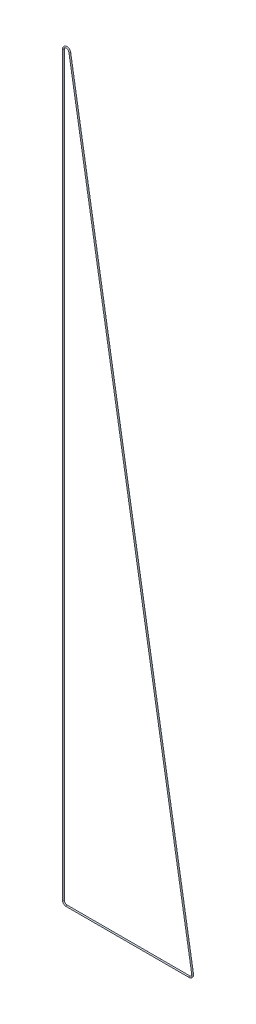
ISO-10303-21;
HEADER;
FILE_DESCRIPTION(('STEP AP214'),'2;1');
FILE_NAME('part.step','',(''),(''),'','','');
FILE_SCHEMA(('AUTOMOTIVE_DESIGN { 1 0 10303 214 1 1 1 1 }'));
ENDSEC;
DATA;
#1=APPLICATION_CONTEXT('core data for automotive mechanical design processes');
#2=APPLICATION_PROTOCOL_DEFINITION('international standard','automotive_design',2000,#1);
#3=PRODUCT_CONTEXT('',#1,'mechanical');
#4=PRODUCT('Part','Part','',(#3));
#5=PRODUCT_RELATED_PRODUCT_CATEGORY('part','',(#4));
#6=PRODUCT_DEFINITION_FORMATION('','',#4);
#7=PRODUCT_DEFINITION_CONTEXT('part definition',#1,'design');
#8=PRODUCT_DEFINITION('design','',#6,#7);
#9=PRODUCT_DEFINITION_SHAPE('','',#8);
#10=(LENGTH_UNIT() NAMED_UNIT(*) SI_UNIT(.MILLI.,.METRE.));
#11=(NAMED_UNIT(*) PLANE_ANGLE_UNIT() SI_UNIT($,.RADIAN.));
#12=(NAMED_UNIT(*) SI_UNIT($,.STERADIAN.) SOLID_ANGLE_UNIT());
#13=UNCERTAINTY_MEASURE_WITH_UNIT(LENGTH_MEASURE(1.E-05),#10,'distance_accuracy_value','');
#14=(GEOMETRIC_REPRESENTATION_CONTEXT(3) GLOBAL_UNCERTAINTY_ASSIGNED_CONTEXT((#13)) GLOBAL_UNIT_ASSIGNED_CONTEXT((#10,
#11,#12)) REPRESENTATION_CONTEXT('',''));
#15=CARTESIAN_POINT('',(0.,0.,0.));
#16=DIRECTION('',(0.,0.,1.));
#17=DIRECTION('',(1.,0.,0.));
#18=AXIS2_PLACEMENT_3D('',#15,#16,#17);
#19=CARTESIAN_POINT('',(388.195395782836,0.,0.));
#20=DIRECTION('',(-1.,0.,0.));
#21=DIRECTION('',(0.,-1.,0.));
#22=AXIS2_PLACEMENT_3D('',#19,#20,#21);
#23=CYLINDRICAL_SURFACE('',#22,2.);
#24=CARTESIAN_POINT('',(388.195395782836,0.,0.));
#25=DIRECTION('',(-1.,1.07555631068124E-12,0.));
#26=DIRECTION('',(0.,0.,1.));
#27=AXIS2_PLACEMENT_3D('',#24,#25,#26);
#28=CIRCLE('',#27,2.);
#29=CARTESIAN_POINT('',(388.195395782836,-1.99999999999998,0.));
#30=VERTEX_POINT('',#29);
#31=EDGE_CURVE('E38',#30,#30,#28,.T.);
#32=ORIENTED_EDGE('',*,*,#31,.T.);
#33=EDGE_LOOP('',(#32));
#34=FACE_BOUND('',#33,.T.);
#35=CARTESIAN_POINT('',(10.,0.,2.));
#36=CARTESIAN_POINT('',(10.,0.0327249565217805,2.00000069417755));
#37=CARTESIAN_POINT('',(10.,0.0654498539758546,1.99919683425031));
#38=CARTESIAN_POINT('',(10.,0.130820843333818,1.99598499057038));
#39=CARTESIAN_POINT('',(10.,0.163466935237708,1.99357700681771));
#40=CARTESIAN_POINT('',(10.,0.228601626080534,1.98716189987108));
#41=CARTESIAN_POINT('',(10.,0.26109022501947,1.98315477667713));
#42=CARTESIAN_POINT('',(10.,0.325831672801977,1.97355126318199));
#43=CARTESIAN_POINT('',(10.,0.358084521645548,1.96795487288081));
#44=CARTESIAN_POINT('',(10.,0.422276766418965,1.95518624873211));
#45=CARTESIAN_POINT('',(10.,0.454216162348811,1.94801401488459));
#46=CARTESIAN_POINT('',(10.,0.517704557264244,1.93211099789358));
#47=CARTESIAN_POINT('',(10.,0.549253556249832,1.92338021475009));
#48=CARTESIAN_POINT('',(10.,0.611885152768017,1.90438112817875));
#49=CARTESIAN_POINT('',(10.,0.642967750300615,1.8941128247509));
#50=CARTESIAN_POINT('',(10.,0.704591663268265,1.87206343598119));
#51=CARTESIAN_POINT('',(10.,0.735132978703317,1.86028235063932));
#52=CARTESIAN_POINT('',(10.,0.795600750757042,1.83523577940583));
#53=CARTESIAN_POINT('',(10.,0.825527207375714,1.82197029351419));
#54=CARTESIAN_POINT('',(10.,0.884693166345415,1.79398687897958));
#55=CARTESIAN_POINT('',(10.,0.913932668696443,1.7792689503366));
#56=CARTESIAN_POINT('',(10.,0.971654278607548,1.74841610705682));
#57=CARTESIAN_POINT('',(10.,1.00013638616762,1.73228119242003));
#58=CARTESIAN_POINT('',(10.,1.05627459060526,1.69863324758106));
#59=CARTESIAN_POINT('',(10.,1.08393068748282,1.68112021737888));
#60=CARTESIAN_POINT('',(10.,1.13835024459559,1.6447582318313));
#61=CARTESIAN_POINT('',(10.,1.16511370483079,1.6259092764859));
#62=CARTESIAN_POINT('',(10.,1.21768351313895,1.58692084943668));
#63=CARTESIAN_POINT('',(10.,1.2434898612119,1.56678137773287));
#64=CARTESIAN_POINT('',(10.,1.29408327544268,1.52526043571808));
#65=CARTESIAN_POINT('',(10.,1.31887034160051,1.50387896540709));
#66=CARTESIAN_POINT('',(10.,1.36736547778757,1.45992553601275));
#67=CARTESIAN_POINT('',(10.,1.3910735478168,1.43735357692939));
#68=CARTESIAN_POINT('',(10.,1.43735357692939,1.3910735478168));
#69=CARTESIAN_POINT('',(10.,1.45992553601275,1.36736547778757));
#70=CARTESIAN_POINT('',(10.,1.50387896540709,1.31887034160051));
#71=CARTESIAN_POINT('',(10.,1.52526043571807,1.29408327544268));
#72=CARTESIAN_POINT('',(10.,1.56678137773288,1.2434898612119));
#73=CARTESIAN_POINT('',(10.,1.58692084943671,1.21768351313895));
#74=CARTESIAN_POINT('',(10.,1.62590927648587,1.16511370483079));
#75=CARTESIAN_POINT('',(10.,1.6447582318312,1.13835024459558));
#76=CARTESIAN_POINT('',(10.,1.68112021737898,1.08393068748283));
#77=CARTESIAN_POINT('',(10.,1.69863324758141,1.05627459060528));
#78=CARTESIAN_POINT('',(10.,1.73228119241967,1.00013638616761));
#79=CARTESIAN_POINT('',(10.,1.7484161070555,0.971654278607483));
#80=CARTESIAN_POINT('',(10.,1.77926895033792,0.913932668696508));
#81=CARTESIAN_POINT('',(10.,1.79398687898452,0.884693166345658));
#82=CARTESIAN_POINT('',(10.,1.82197029350925,0.825527207375472));
#83=CARTESIAN_POINT('',(10.,1.83523577938738,0.795600750756136));
#84=CARTESIAN_POINT('',(10.,1.86028235065777,0.735132978704224));
#85=CARTESIAN_POINT('',(10.,1.87206343605003,0.704591663271647));
#86=CARTESIAN_POINT('',(10.,1.89411282468206,0.642967750297233));
#87=CARTESIAN_POINT('',(10.,1.90438112792184,0.611885152755396));
#88=CARTESIAN_POINT('',(10.,1.923380215007,0.549253556262454));
#89=CARTESIAN_POINT('',(10.,1.93211099885239,0.517704557311348));
#90=CARTESIAN_POINT('',(10.,1.94801401392578,0.454216162301708));
#91=CARTESIAN_POINT('',(10.,1.95518624515378,0.422276766243174));
#92=CARTESIAN_POINT('',(10.,1.96795487645914,0.358084521821341));
#93=CARTESIAN_POINT('',(10.,1.9735512765365,0.325831673458043));
#94=CARTESIAN_POINT('',(10.,1.98315476332262,0.261090224363406));
#95=CARTESIAN_POINT('',(10.,1.98716185003137,0.228601623632067));
#96=CARTESIAN_POINT('',(10.,1.99357705665741,0.163466937686176));
#97=CARTESIAN_POINT('',(10.,1.9959851765747,0.130820852471624));
#98=CARTESIAN_POINT('',(10.,1.99919664824599,0.0654498448380481));
#99=CARTESIAN_POINT('',(10.,2.,0.0327249224190242));
#100=CARTESIAN_POINT('',(10.,2.,-0.0327249224190237));
#101=CARTESIAN_POINT('',(10.,1.99919664824599,-0.0654498448380476));
#102=CARTESIAN_POINT('',(10.,1.9959851765747,-0.130820852471623));
#103=CARTESIAN_POINT('',(10.,1.99357705665741,-0.163466937686175));
#104=CARTESIAN_POINT('',(10.,1.98716185003137,-0.228601623632066));
#105=CARTESIAN_POINT('',(10.,1.98315476332262,-0.261090224363405));
#106=CARTESIAN_POINT('',(10.,1.9735512765365,-0.325831673458041));
#107=CARTESIAN_POINT('',(10.,1.96795487645914,-0.35808452182134));
#108=CARTESIAN_POINT('',(10.,1.95518624515378,-0.422276766243173));
#109=CARTESIAN_POINT('',(10.,1.94801401392578,-0.454216162301707));
#110=CARTESIAN_POINT('',(10.,1.93211099885239,-0.517704557311348));
#111=CARTESIAN_POINT('',(10.,1.923380215007,-0.549253556262453));
#112=CARTESIAN_POINT('',(10.,1.90438112792184,-0.611885152755396));
#113=CARTESIAN_POINT('',(10.,1.89411282468206,-0.642967750297233));
#114=CARTESIAN_POINT('',(10.,1.87206343605003,-0.704591663271647));
#115=CARTESIAN_POINT('',(10.,1.86028235065777,-0.735132978704223));
#116=CARTESIAN_POINT('',(10.,1.83523577938738,-0.795600750756135));
#117=CARTESIAN_POINT('',(10.,1.82197029350925,-0.825527207375471));
#118=CARTESIAN_POINT('',(10.,1.79398687898452,-0.884693166345657));
#119=CARTESIAN_POINT('',(10.,1.77926895033792,-0.913932668696508));
#120=CARTESIAN_POINT('',(10.,1.7484161070555,-0.971654278607483));
#121=CARTESIAN_POINT('',(10.,1.73228119241967,-1.00013638616761));
#122=CARTESIAN_POINT('',(10.,1.69863324758141,-1.05627459060528));
#123=CARTESIAN_POINT('',(10.,1.68112021737898,-1.08393068748283));
#124=CARTESIAN_POINT('',(10.,1.6447582318312,-1.13835024459558));
#125=CARTESIAN_POINT('',(10.,1.62590927648587,-1.16511370483079));
#126=CARTESIAN_POINT('',(10.,1.58692084943671,-1.21768351313895));
#127=CARTESIAN_POINT('',(10.,1.56678137773288,-1.2434898612119));
#128=CARTESIAN_POINT('',(10.,1.52526043571807,-1.29408327544268));
#129=CARTESIAN_POINT('',(10.,1.50387896540709,-1.31887034160051));
#130=CARTESIAN_POINT('',(10.,1.45992553601275,-1.36736547778757));
#131=CARTESIAN_POINT('',(10.,1.43735357692939,-1.3910735478168));
#132=CARTESIAN_POINT('',(10.,1.3910735478168,-1.43735357692939));
#133=CARTESIAN_POINT('',(10.,1.36736547778757,-1.45992553601275));
#134=CARTESIAN_POINT('',(10.,1.31887034160051,-1.50387896540709));
#135=CARTESIAN_POINT('',(10.,1.29408327544268,-1.52526043571807));
#136=CARTESIAN_POINT('',(10.,1.2434898612119,-1.56678137773288));
#137=CARTESIAN_POINT('',(10.,1.21768351313895,-1.58692084943671));
#138=CARTESIAN_POINT('',(10.,1.16511370483079,-1.62590927648587));
#139=CARTESIAN_POINT('',(10.,1.13835024459558,-1.64475823183121));
#140=CARTESIAN_POINT('',(10.,1.08393068748283,-1.68112021737898));
#141=CARTESIAN_POINT('',(10.,1.05627459060528,-1.69863324758141));
#142=CARTESIAN_POINT('',(10.,1.00013638616761,-1.73228119241967));
#143=CARTESIAN_POINT('',(10.,0.971654278607483,-1.7484161070555));
#144=CARTESIAN_POINT('',(10.,0.913932668696508,-1.77926895033792));
#145=CARTESIAN_POINT('',(10.,0.884693166345657,-1.79398687898452));
#146=CARTESIAN_POINT('',(10.,0.825527207375471,-1.82197029350925));
#147=CARTESIAN_POINT('',(10.,0.795600750756136,-1.83523577938738));
#148=CARTESIAN_POINT('',(10.,0.735132978704224,-1.86028235065777));
#149=CARTESIAN_POINT('',(10.,0.704591663271648,-1.87206343605002));
#150=CARTESIAN_POINT('',(10.,0.642967750297235,-1.89411282468206));
#151=CARTESIAN_POINT('',(10.,0.611885152755398,-1.90438112792183));
#152=CARTESIAN_POINT('',(10.,0.549253556262455,-1.923380215007));
#153=CARTESIAN_POINT('',(10.,0.517704557311348,-1.93211099885239));
#154=CARTESIAN_POINT('',(9.99999999999999,0.454216162301707,-1.94801401392578));
#155=CARTESIAN_POINT('',(10.,0.422276766243172,-1.95518624515378));
#156=CARTESIAN_POINT('',(10.,0.358084521821339,-1.96795487645914));
#157=CARTESIAN_POINT('',(10.,0.325831673458041,-1.9735512765365));
#158=CARTESIAN_POINT('',(10.,0.261090224363405,-1.98315476332262));
#159=CARTESIAN_POINT('',(10.,0.228601623632066,-1.98716185003137));
#160=CARTESIAN_POINT('',(10.,0.163466937686176,-1.99357705665741));
#161=CARTESIAN_POINT('',(10.,0.130820852471624,-1.9959851765747));
#162=CARTESIAN_POINT('',(10.,0.0654498448380486,-1.99919664824599));
#163=CARTESIAN_POINT('',(10.,0.0327249224190243,-2.));
#164=CARTESIAN_POINT('',(10.,-0.0327249224190237,-2.));
#165=CARTESIAN_POINT('',(10.,-0.0654498448380474,-1.99919664824599));
#166=CARTESIAN_POINT('',(10.,-0.130820852471623,-1.9959851765747));
#167=CARTESIAN_POINT('',(10.,-0.163466937686175,-1.99357705665741));
#168=CARTESIAN_POINT('',(10.,-0.228601623632065,-1.98716185003137));
#169=CARTESIAN_POINT('',(10.,-0.261090224363403,-1.98315476332262));
#170=CARTESIAN_POINT('',(10.,-0.32583167345804,-1.9735512765365));
#171=CARTESIAN_POINT('',(10.,-0.358084521821338,-1.96795487645914));
#172=CARTESIAN_POINT('',(10.,-0.422276766243171,-1.95518624515378));
#173=CARTESIAN_POINT('',(10.,-0.454216162301706,-1.94801401392578));
#174=CARTESIAN_POINT('',(10.,-0.517704557311346,-1.93211099885239));
#175=CARTESIAN_POINT('',(10.,-0.549253556262453,-1.923380215007));
#176=CARTESIAN_POINT('',(10.,-0.611885152755397,-1.90438112792183));
#177=CARTESIAN_POINT('',(10.,-0.642967750297234,-1.89411282468206));
#178=CARTESIAN_POINT('',(10.,-0.704591663271648,-1.87206343605002));
#179=CARTESIAN_POINT('',(10.,-0.735132978704224,-1.86028235065777));
#180=CARTESIAN_POINT('',(10.,-0.795600750756136,-1.83523577938738));
#181=CARTESIAN_POINT('',(10.,-0.825527207375471,-1.82197029350925));
#182=CARTESIAN_POINT('',(10.,-0.884693166345657,-1.79398687898452));
#183=CARTESIAN_POINT('',(10.,-0.913932668696508,-1.77926895033792));
#184=CARTESIAN_POINT('',(10.,-0.971654278607483,-1.7484161070555));
#185=CARTESIAN_POINT('',(10.,-1.00013638616761,-1.73228119241968));
#186=CARTESIAN_POINT('',(10.,-1.05627459060528,-1.69863324758141));
#187=CARTESIAN_POINT('',(10.,-1.08393068748283,-1.68112021737898));
#188=CARTESIAN_POINT('',(10.,-1.13835024459558,-1.64475823183121));
#189=CARTESIAN_POINT('',(10.,-1.16511370483079,-1.62590927648587));
#190=CARTESIAN_POINT('',(10.,-1.21768351313895,-1.58692084943671));
#191=CARTESIAN_POINT('',(10.,-1.2434898612119,-1.56678137773288));
#192=CARTESIAN_POINT('',(10.,-1.29408327544268,-1.52526043571807));
#193=CARTESIAN_POINT('',(10.,-1.31887034160051,-1.50387896540709));
#194=CARTESIAN_POINT('',(10.,-1.36736547778757,-1.45992553601275));
#195=CARTESIAN_POINT('',(10.,-1.3910735478168,-1.43735357692939));
#196=CARTESIAN_POINT('',(9.99999999999999,-1.43735357692939,-1.3910735478168));
#197=CARTESIAN_POINT('',(10.,-1.45992553601275,-1.36736547778757));
#198=CARTESIAN_POINT('',(10.,-1.50387896540709,-1.31887034160051));
#199=CARTESIAN_POINT('',(10.,-1.52526043571807,-1.29408327544268));
#200=CARTESIAN_POINT('',(10.,-1.56678137773288,-1.2434898612119));
#201=CARTESIAN_POINT('',(10.,-1.58692084943671,-1.21768351313895));
#202=CARTESIAN_POINT('',(10.,-1.62590927648587,-1.16511370483079));
#203=CARTESIAN_POINT('',(10.,-1.6447582318312,-1.13835024459558));
#204=CARTESIAN_POINT('',(10.,-1.68112021737898,-1.08393068748283));
#205=CARTESIAN_POINT('',(10.,-1.69863324758141,-1.05627459060528));
#206=CARTESIAN_POINT('',(10.,-1.73228119241967,-1.00013638616761));
#207=CARTESIAN_POINT('',(10.,-1.7484161070555,-0.971654278607483));
#208=CARTESIAN_POINT('',(10.,-1.77926895033792,-0.913932668696508));
#209=CARTESIAN_POINT('',(10.,-1.79398687898452,-0.884693166345658));
#210=CARTESIAN_POINT('',(10.,-1.82197029350925,-0.825527207375472));
#211=CARTESIAN_POINT('',(10.,-1.83523577938738,-0.795600750756137));
#212=CARTESIAN_POINT('',(10.,-1.86028235065777,-0.735132978704225));
#213=CARTESIAN_POINT('',(10.,-1.87206343605002,-0.704591663271648));
#214=CARTESIAN_POINT('',(10.,-1.89411282468206,-0.642967750297235));
#215=CARTESIAN_POINT('',(10.,-1.90438112792183,-0.611885152755398));
#216=CARTESIAN_POINT('',(10.,-1.923380215007,-0.549253556262454));
#217=CARTESIAN_POINT('',(10.,-1.93211099885239,-0.517704557311348));
#218=CARTESIAN_POINT('',(9.99999999999999,-1.94801401392578,-0.454216162301707));
#219=CARTESIAN_POINT('',(10.,-1.95518624515378,-0.422276766243172));
#220=CARTESIAN_POINT('',(10.,-1.96795487645914,-0.358084521821339));
#221=CARTESIAN_POINT('',(10.,-1.9735512765365,-0.325831673458041));
#222=CARTESIAN_POINT('',(10.,-1.98315476332262,-0.261090224363405));
#223=CARTESIAN_POINT('',(10.,-1.98716185003137,-0.228601623632066));
#224=CARTESIAN_POINT('',(10.,-1.99357705665741,-0.163466937686176));
#225=CARTESIAN_POINT('',(10.,-1.9959851765747,-0.130820852471624));
#226=CARTESIAN_POINT('',(10.,-1.99919664824599,-0.0654498448380483));
#227=CARTESIAN_POINT('',(10.,-2.,-0.0327249224190244));
#228=CARTESIAN_POINT('',(10.,-2.,0.0327249224190234));
#229=CARTESIAN_POINT('',(10.,-1.99919664824599,0.0654498448380473));
#230=CARTESIAN_POINT('',(10.,-1.9959851765747,0.130820852471623));
#231=CARTESIAN_POINT('',(10.,-1.99357705665741,0.163466937686175));
#232=CARTESIAN_POINT('',(10.,-1.98716185003137,0.228601623632065));
#233=CARTESIAN_POINT('',(10.,-1.98315476332262,0.261090224363404));
#234=CARTESIAN_POINT('',(10.,-1.9735512765365,0.32583167345804));
#235=CARTESIAN_POINT('',(10.,-1.96795487645914,0.358084521821338));
#236=CARTESIAN_POINT('',(10.,-1.95518624515378,0.422276766243171));
#237=CARTESIAN_POINT('',(10.,-1.94801401392578,0.454216162301706));
#238=CARTESIAN_POINT('',(10.,-1.93211099885239,0.517704557311347));
#239=CARTESIAN_POINT('',(10.,-1.923380215007,0.549253556262453));
#240=CARTESIAN_POINT('',(9.99999999999999,-1.90438112792183,0.611885152755397));
#241=CARTESIAN_POINT('',(10.,-1.89411282468206,0.642967750297234));
#242=CARTESIAN_POINT('',(10.,-1.87206343605003,0.704591663271648));
#243=CARTESIAN_POINT('',(10.,-1.86028235065777,0.735132978704224));
#244=CARTESIAN_POINT('',(10.,-1.83523577938738,0.795600750756136));
#245=CARTESIAN_POINT('',(10.,-1.82197029350925,0.825527207375471));
#246=CARTESIAN_POINT('',(10.,-1.79398687898452,0.884693166345657));
#247=CARTESIAN_POINT('',(10.,-1.77926895033792,0.913932668696508));
#248=CARTESIAN_POINT('',(10.,-1.7484161070555,0.971654278607482));
#249=CARTESIAN_POINT('',(10.,-1.73228119241967,1.00013638616761));
#250=CARTESIAN_POINT('',(10.,-1.69863324758141,1.05627459060528));
#251=CARTESIAN_POINT('',(10.,-1.68112021737898,1.08393068748283));
#252=CARTESIAN_POINT('',(10.,-1.6447582318312,1.13835024459558));
#253=CARTESIAN_POINT('',(10.,-1.62590927648587,1.16511370483079));
#254=CARTESIAN_POINT('',(10.,-1.58692084943671,1.21768351313895));
#255=CARTESIAN_POINT('',(10.,-1.56678137773288,1.2434898612119));
#256=CARTESIAN_POINT('',(10.,-1.52526043571807,1.29408327544268));
#257=CARTESIAN_POINT('',(10.,-1.50387896540709,1.31887034160051));
#258=CARTESIAN_POINT('',(10.,-1.45992553601275,1.36736547778757));
#259=CARTESIAN_POINT('',(10.,-1.43735357692939,1.3910735478168));
#260=CARTESIAN_POINT('',(10.,-1.3910735478168,1.43735357692939));
#261=CARTESIAN_POINT('',(10.,-1.36736547778757,1.45992553601275));
#262=CARTESIAN_POINT('',(9.99999999999999,-1.31887034160051,1.50387896540709));
#263=CARTESIAN_POINT('',(10.,-1.29408327544268,1.52526043571808));
#264=CARTESIAN_POINT('',(10.,-1.2434898612119,1.56678137773287));
#265=CARTESIAN_POINT('',(10.,-1.21768351313894,1.58692084943668));
#266=CARTESIAN_POINT('',(10.,-1.16511370483079,1.6259092764859));
#267=CARTESIAN_POINT('',(10.,-1.13835024459559,1.6447582318313));
#268=CARTESIAN_POINT('',(10.,-1.08393068748282,1.68112021737888));
#269=CARTESIAN_POINT('',(10.,-1.05627459060526,1.69863324758106));
#270=CARTESIAN_POINT('',(10.,-1.00013638616762,1.73228119242003));
#271=CARTESIAN_POINT('',(10.,-0.971654278607548,1.74841610705682));
#272=CARTESIAN_POINT('',(10.,-0.913932668696443,1.7792689503366));
#273=CARTESIAN_POINT('',(10.,-0.884693166345415,1.79398687897958));
#274=CARTESIAN_POINT('',(10.,-0.825527207375715,1.82197029351419));
#275=CARTESIAN_POINT('',(10.,-0.795600750757043,1.83523577940583));
#276=CARTESIAN_POINT('',(10.,-0.735132978703319,1.86028235063932));
#277=CARTESIAN_POINT('',(10.,-0.704591663268265,1.87206343598119));
#278=CARTESIAN_POINT('',(10.,-0.642967750300615,1.8941128247509));
#279=CARTESIAN_POINT('',(10.,-0.611885152768019,1.90438112817875));
#280=CARTESIAN_POINT('',(10.,-0.549253556249833,1.92338021475009));
#281=CARTESIAN_POINT('',(10.,-0.517704557264245,1.93211099789358));
#282=CARTESIAN_POINT('',(9.99999999999999,-0.454216162348811,1.94801401488459));
#283=CARTESIAN_POINT('',(10.,-0.422276766418965,1.95518624873211));
#284=CARTESIAN_POINT('',(10.,-0.358084521645548,1.96795487288081));
#285=CARTESIAN_POINT('',(10.,-0.325831672801977,1.97355126318199));
#286=CARTESIAN_POINT('',(10.,-0.26109022501947,1.98315477667713));
#287=CARTESIAN_POINT('',(10.,-0.228601626080534,1.98716189987108));
#288=CARTESIAN_POINT('',(10.,-0.163466935237708,1.99357700681771));
#289=CARTESIAN_POINT('',(10.,-0.130820843333818,1.99598499057038));
#290=CARTESIAN_POINT('',(10.,-0.0654498539758546,1.99919683425031));
#291=CARTESIAN_POINT('',(10.,-0.0327249565217805,2.00000069417755));
#292=CARTESIAN_POINT('',(10.,0.,2.));
#293=B_SPLINE_CURVE_WITH_KNOTS('',3,(#35,#36,#37,#38,#39,#40,#41,#42,#43,#44,#45,#46,#47,#48,
#49,#50,#51,#52,#53,#54,#55,#56,#57,#58,#59,#60,#61,#62,#63,#64,#65,#66,#67,#68,#69,#70,#71,#72,
#73,#74,#75,#76,#77,#78,#79,#80,#81,#82,#83,#84,#85,#86,#87,#88,#89,#90,#91,#92,#93,#94,#95,#96,
#97,#98,#99,#100,#101,#102,#103,#104,#105,#106,#107,#108,#109,#110,#111,#112,#113,#114,#115,
#116,#117,#118,#119,#120,#121,#122,#123,#124,#125,#126,#127,#128,#129,#130,#131,#132,#133,#134,
#135,#136,#137,#138,#139,#140,#141,#142,#143,#144,#145,#146,#147,#148,#149,#150,#151,#152,#153,
#154,#155,#156,#157,#158,#159,#160,#161,#162,#163,#164,#165,#166,#167,#168,#169,#170,#171,#172,
#173,#174,#175,#176,#177,#178,#179,#180,#181,#182,#183,#184,#185,#186,#187,#188,#189,#190,#191,
#192,#193,#194,#195,#196,#197,#198,#199,#200,#201,#202,#203,#204,#205,#206,#207,#208,#209,#210,
#211,#212,#213,#214,#215,#216,#217,#218,#219,#220,#221,#222,#223,#224,#225,#226,#227,#228,#229,
#230,#231,#232,#233,#234,#235,#236,#237,#238,#239,#240,#241,#242,#243,#244,#245,#246,#247,#248,
#249,#250,#251,#252,#253,#254,#255,#256,#257,#258,#259,#260,#261,#262,#263,#264,#265,#266,#267,
#268,#269,#270,#271,#272,#273,#274,#275,#276,#277,#278,#279,#280,#281,#282,#283,#284,#285,#286,
#287,#288,#289,#290,#291,#292),.UNSPECIFIED.,.F.,.F.,(4,2,2,2,2,2,2,2,2,2,2,2,2,2,2,2,2,2,2,2,2,
2,2,2,2,2,2,2,2,2,2,2,2,2,2,2,2,2,2,2,2,2,2,2,2,2,2,2,2,2,2,2,2,2,2,2,2,2,2,2,2,2,2,2,2,2,2,2,2,
2,2,2,2,2,2,2,2,2,2,2,2,2,2,2,2,2,2,2,2,2,2,2,2,2,2,2,2,2,2,2,2,2,2,2,2,2,2,2,2,2,2,2,2,2,2,2,2,
2,2,2,2,2,2,2,2,2,2,2,4),(0.,0.09816491409165,0.196329828183298,0.294494742274947,
0.392659656366597,0.490824570458245,0.588989484549895,0.687154398641543,0.785319312733193,
0.883484226824843,0.981649140916491,1.07981405500814,1.17797896909979,1.27614388319144,
1.37430879728309,1.47247371137474,1.57063862546639,1.66880353955804,1.76696845364968,
1.86513336774133,1.96329828183298,2.06146319592463,2.15962811001628,2.25779302410793,
2.35595793819958,2.45412285229123,2.55228776638288,2.65045268047453,2.74861759456617,
2.84678250865782,2.94494742274947,3.04311233684112,3.14127725093277,3.23944216502442,
3.33760707911607,3.43577199320772,3.53393690729937,3.63210182139102,3.73026673548267,
3.82843164957431,3.92659656366596,4.02476147775761,4.12292639184926,4.22109130594091,
4.31925622003256,4.41742113412421,4.51558604821586,4.61375096230751,4.71191587639916,
4.81008079049081,4.90824570458246,5.00641061867411,5.10457553276576,5.2027404468574,
5.30090536094905,5.3990702750407,5.49723518913235,5.595400103224,5.69356501731565,
5.7917299314073,5.88989484549895,5.9880597595906,6.08622467368225,6.1843895877739,
6.28255450186555,6.38071941595719,6.47888433004884,6.57704924414049,6.67521415823214,
6.77337907232379,6.87154398641544,6.96970890050709,7.06787381459874,7.16603872869039,
7.26420364278204,7.36236855687369,7.46053347096534,7.55869838505699,7.65686329914863,
7.75502821324028,7.85319312733193,7.95135804142358,8.04952295551523,8.14768786960688,
8.24585278369853,8.34401769779018,8.44218261188183,8.54034752597348,8.63851244006513,
8.73667735415678,8.83484226824843,8.93300718234008,9.03117209643173,9.12933701052338,
9.22750192461503,9.32566683870668,9.42383175279832,9.52199666688997,9.62016158098162,
9.71832649507327,9.81649140916492,9.91465632325657,10.0128212373482,10.1109861514399,
10.2091510655315,10.3073159796232,10.4054808937148,10.5036458078065,10.6018107218981,
10.6999756359898,10.7981405500814,10.8963054641731,10.9944703782647,11.0926352923564,
11.190800206448,11.2889651205397,11.3871300346313,11.485294948723,11.5834598628146,
11.6816247769063,11.7797896909979,11.8779546050896,11.9761195191812,12.0742844332729,
12.1724493473645,12.2706142614562,12.3687791755478,12.4669440896394,12.5651090037311),.UNSPECIFIED.);
#294=CARTESIAN_POINT('',(10.,0.,2.));
#295=VERTEX_POINT('',#294);
#296=EDGE_CURVE('E10',#295,#295,#293,.T.);
#297=ORIENTED_EDGE('',*,*,#296,.F.);
#298=EDGE_LOOP('',(#297));
#299=FACE_BOUND('',#298,.T.);
#300=ADVANCED_FACE('F28',(#34,#299),#23,.T.);
#301=CARTESIAN_POINT('',(388.195395782836,10.,0.));
#302=DIRECTION('',(0.,0.,1.));
#303=DIRECTION('',(-1.,0.,0.));
#304=AXIS2_PLACEMENT_3D('',#301,#302,#303);
#305=TOROIDAL_SURFACE('',#304,10.,2.);
#306=CARTESIAN_POINT('',(398.059335021158,11.6439898730536,0.));
#307=DIRECTION('',(0.164398987304308,-0.986393923832318,0.));
#308=DIRECTION('',(0.,0.,1.));
#309=AXIS2_PLACEMENT_3D('',#306,#307,#308);
#310=CIRCLE('',#309,2.);
#311=CARTESIAN_POINT('',(400.032122868822,11.9727878476643,0.));
#312=VERTEX_POINT('',#311);
#313=EDGE_CURVE('E42',#312,#312,#310,.T.);
#314=CARTESIAN_POINT('',(388.195395782836,10.,0.));
#315=DIRECTION('',(0.,0.,1.));
#316=DIRECTION('',(-1.,0.,0.));
#317=AXIS2_PLACEMENT_3D('',#314,#315,#316);
#318=CIRCLE('',#317,12.);
#319=EDGE_CURVE('',#30,#312,#318,.T.);
#320=ORIENTED_EDGE('',*,*,#31,.F.);
#321=ORIENTED_EDGE('',*,*,#313,.T.);
#322=ORIENTED_EDGE('',*,*,#319,.T.);
#323=ORIENTED_EDGE('',*,*,#319,.F.);
#324=EDGE_LOOP('',(#320,#322,#321,#323));
#325=FACE_BOUND('',#324,.T.);
#326=ADVANCED_FACE('F61',(#325),#305,.T.);
#327=CARTESIAN_POINT('',(19.8639392383222,2280.81636457007,0.));
#328=DIRECTION('',(0.164398987305357,-0.986393923832144,0.));
#329=DIRECTION('',(0.986393923832144,0.164398987305357,0.));
#330=AXIS2_PLACEMENT_3D('',#327,#328,#329);
#331=CYLINDRICAL_SURFACE('',#330,2.);
#332=CARTESIAN_POINT('',(19.8639392383222,2280.81636457007,0.));
#333=DIRECTION('',(0.164398987304308,-0.986393923832318,0.));
#334=DIRECTION('',(0.,0.,1.));
#335=AXIS2_PLACEMENT_3D('',#332,#333,#334);
#336=CIRCLE('',#335,2.);
#337=CARTESIAN_POINT('',(21.8367270859867,2281.14516254468,0.));
#338=VERTEX_POINT('',#337);
#339=EDGE_CURVE('E47',#338,#338,#336,.T.);
#340=ORIENTED_EDGE('',*,*,#339,.T.);
#341=EDGE_LOOP('',(#340));
#342=FACE_BOUND('',#341,.T.);
#343=ORIENTED_EDGE('',*,*,#313,.F.);
#344=EDGE_LOOP('',(#343));
#345=FACE_BOUND('',#344,.T.);
#346=ADVANCED_FACE('F65',(#342,#345),#331,.T.);
#347=CARTESIAN_POINT('',(10.,2279.17237469702,0.));
#348=DIRECTION('',(0.,0.,1.));
#349=DIRECTION('',(-1.,0.,0.));
#350=AXIS2_PLACEMENT_3D('',#347,#348,#349);
#351=TOROIDAL_SURFACE('',#350,10.,2.);
#352=CARTESIAN_POINT('',(0.,2279.17237469701,0.));
#353=DIRECTION('',(0.,1.,0.));
#354=DIRECTION('',(0.,0.,1.));
#355=AXIS2_PLACEMENT_3D('',#352,#353,#354);
#356=CIRCLE('',#355,2.);
#357=CARTESIAN_POINT('',(-2.,2279.17237469701,0.));
#358=VERTEX_POINT('',#357);
#359=EDGE_CURVE('E90',#358,#358,#356,.T.);
#360=CARTESIAN_POINT('',(10.,2279.17237469702,0.));
#361=DIRECTION('',(0.,0.,1.));
#362=DIRECTION('',(-1.,0.,0.));
#363=AXIS2_PLACEMENT_3D('',#360,#361,#362);
#364=CIRCLE('',#363,12.);
#365=EDGE_CURVE('',#338,#358,#364,.T.);
#366=ORIENTED_EDGE('',*,*,#339,.F.);
#367=ORIENTED_EDGE('',*,*,#359,.T.);
#368=ORIENTED_EDGE('',*,*,#365,.T.);
#369=ORIENTED_EDGE('',*,*,#365,.F.);
#370=EDGE_LOOP('',(#366,#368,#367,#369));
#371=FACE_BOUND('',#370,.T.);
#372=ADVANCED_FACE('F70',(#371),#351,.T.);
#373=CARTESIAN_POINT('',(0.,10.0000000000001,0.));
#374=DIRECTION('',(0.,1.,0.));
#375=DIRECTION('',(0.,0.,-1.));
#376=AXIS2_PLACEMENT_3D('',#373,#374,#375);
#377=CYLINDRICAL_SURFACE('',#376,2.);
#378=CARTESIAN_POINT('',(0.,10.0000000000001,0.));
#379=DIRECTION('',(0.,1.,0.));
#380=DIRECTION('',(0.,0.,1.));
#381=AXIS2_PLACEMENT_3D('',#378,#379,#380);
#382=CIRCLE('',#381,2.);
#383=CARTESIAN_POINT('',(0.,10.0000000000001,2.));
#384=VERTEX_POINT('',#383);
#385=EDGE_CURVE('E89',#384,#384,#382,.T.);
#386=ORIENTED_EDGE('',*,*,#385,.T.);
#387=EDGE_LOOP('',(#386));
#388=FACE_BOUND('',#387,.T.);
#389=ORIENTED_EDGE('',*,*,#359,.F.);
#390=EDGE_LOOP('',(#389));
#391=FACE_BOUND('',#390,.T.);
#392=ADVANCED_FACE('F77',(#388,#391),#377,.T.);
#393=CARTESIAN_POINT('',(10.,10.,0.));
#394=DIRECTION('',(0.,0.,-1.));
#395=DIRECTION('',(1.,0.,0.));
#396=AXIS2_PLACEMENT_3D('',#393,#394,#395);
#397=TOROIDAL_SURFACE('',#396,10.,2.);
#398=ORIENTED_EDGE('',*,*,#385,.F.);
#399=EDGE_LOOP('',(#398));
#400=FACE_BOUND('',#399,.T.);
#401=ORIENTED_EDGE('',*,*,#296,.T.);
#402=EDGE_LOOP('',(#401));
#403=FACE_BOUND('',#402,.T.);
#404=ADVANCED_FACE('F80',(#400,#403),#397,.T.);
#405=CLOSED_SHELL('',(#300,#326,#346,#372,#392,#404));
#406=MANIFOLD_SOLID_BREP('B2',#405);
#407=ADVANCED_BREP_SHAPE_REPRESENTATION('',(#18,#406),#14);
#408=SHAPE_DEFINITION_REPRESENTATION(#9,#407);
ENDSEC;
END-ISO-10303-21;
